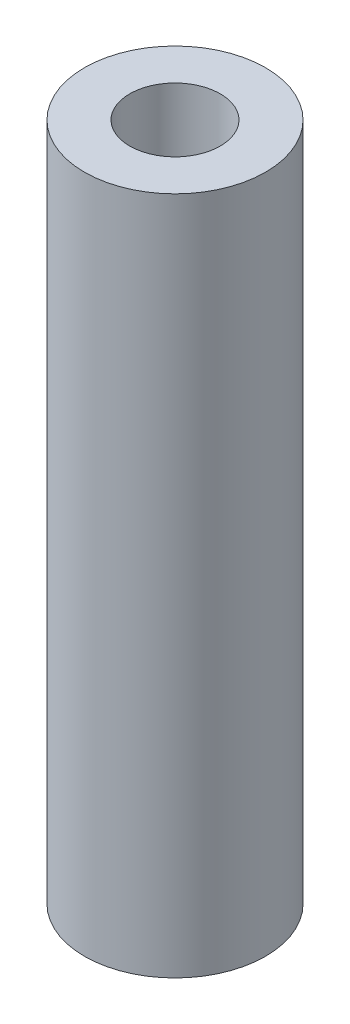
ISO-10303-21;
HEADER;
FILE_DESCRIPTION(('STEP AP214'),'2;1');
FILE_NAME('part.step','',(''),(''),'','','');
FILE_SCHEMA(('AUTOMOTIVE_DESIGN { 1 0 10303 214 1 1 1 1 }'));
ENDSEC;
DATA;
#1=APPLICATION_CONTEXT('core data for automotive mechanical design processes');
#2=APPLICATION_PROTOCOL_DEFINITION('international standard','automotive_design',2000,#1);
#3=PRODUCT_CONTEXT('',#1,'mechanical');
#4=PRODUCT('Part','Part','',(#3));
#5=PRODUCT_RELATED_PRODUCT_CATEGORY('part','',(#4));
#6=PRODUCT_DEFINITION_FORMATION('','',#4);
#7=PRODUCT_DEFINITION_CONTEXT('part definition',#1,'design');
#8=PRODUCT_DEFINITION('design','',#6,#7);
#9=PRODUCT_DEFINITION_SHAPE('','',#8);
#10=(LENGTH_UNIT() NAMED_UNIT(*) SI_UNIT(.MILLI.,.METRE.));
#11=(NAMED_UNIT(*) PLANE_ANGLE_UNIT() SI_UNIT($,.RADIAN.));
#12=(NAMED_UNIT(*) SI_UNIT($,.STERADIAN.) SOLID_ANGLE_UNIT());
#13=UNCERTAINTY_MEASURE_WITH_UNIT(LENGTH_MEASURE(1.E-05),#10,'distance_accuracy_value','');
#14=(GEOMETRIC_REPRESENTATION_CONTEXT(3) GLOBAL_UNCERTAINTY_ASSIGNED_CONTEXT((#13)) GLOBAL_UNIT_ASSIGNED_CONTEXT((#10,
#11,#12)) REPRESENTATION_CONTEXT('',''));
#15=CARTESIAN_POINT('',(0.,0.,0.));
#16=DIRECTION('',(0.,0.,1.));
#17=DIRECTION('',(1.,0.,0.));
#18=AXIS2_PLACEMENT_3D('',#15,#16,#17);
#19=CARTESIAN_POINT('',(0.,30.,0.));
#20=DIRECTION('',(0.,-1.,0.));
#21=DIRECTION('',(0.,0.,-1.));
#22=AXIS2_PLACEMENT_3D('',#19,#20,#21);
#23=CYLINDRICAL_SURFACE('',#22,4.);
#24=CARTESIAN_POINT('',(0.,30.,0.));
#25=DIRECTION('',(0.,1.,0.));
#26=DIRECTION('',(0.,0.,1.));
#27=AXIS2_PLACEMENT_3D('',#24,#25,#26);
#28=CIRCLE('',#27,4.);
#29=CARTESIAN_POINT('',(0.,30.,4.));
#30=VERTEX_POINT('',#29);
#31=EDGE_CURVE('E10',#30,#30,#28,.T.);
#32=ORIENTED_EDGE('',*,*,#31,.F.);
#33=EDGE_LOOP('',(#32));
#34=FACE_BOUND('',#33,.T.);
#35=CARTESIAN_POINT('',(0.,0.,0.));
#36=DIRECTION('',(0.,1.,0.));
#37=DIRECTION('',(0.,0.,1.));
#38=AXIS2_PLACEMENT_3D('',#35,#36,#37);
#39=CIRCLE('',#38,4.);
#40=CARTESIAN_POINT('',(0.,0.,4.));
#41=VERTEX_POINT('',#40);
#42=EDGE_CURVE('E46',#41,#41,#39,.T.);
#43=ORIENTED_EDGE('',*,*,#42,.T.);
#44=EDGE_LOOP('',(#43));
#45=FACE_BOUND('',#44,.T.);
#46=ADVANCED_FACE('F43',(#34,#45),#23,.T.);
#47=CARTESIAN_POINT('',(0.,30.,0.));
#48=DIRECTION('',(0.,1.,0.));
#49=DIRECTION('',(0.,0.,1.));
#50=AXIS2_PLACEMENT_3D('',#47,#48,#49);
#51=PLANE('',#50);
#52=CARTESIAN_POINT('',(0.,30.,0.));
#53=DIRECTION('',(0.,1.,0.));
#54=DIRECTION('',(0.,0.,1.));
#55=AXIS2_PLACEMENT_3D('',#52,#53,#54);
#56=CIRCLE('',#55,2.);
#57=CARTESIAN_POINT('',(0.,30.,2.));
#58=VERTEX_POINT('',#57);
#59=EDGE_CURVE('E57',#58,#58,#56,.T.);
#60=ORIENTED_EDGE('',*,*,#59,.F.);
#61=EDGE_LOOP('',(#60));
#62=FACE_BOUND('',#61,.T.);
#63=ORIENTED_EDGE('',*,*,#31,.T.);
#64=EDGE_LOOP('',(#63));
#65=FACE_BOUND('',#64,.T.);
#66=ADVANCED_FACE('F74',(#62,#65),#51,.T.);
#67=CARTESIAN_POINT('',(0.,0.,0.));
#68=DIRECTION('',(0.,1.,0.));
#69=DIRECTION('',(0.,0.,1.));
#70=AXIS2_PLACEMENT_3D('',#67,#68,#69);
#71=PLANE('',#70);
#72=CARTESIAN_POINT('',(0.,0.,0.));
#73=DIRECTION('',(0.,1.,0.));
#74=DIRECTION('',(0.,0.,1.));
#75=AXIS2_PLACEMENT_3D('',#72,#73,#74);
#76=CIRCLE('',#75,2.);
#77=CARTESIAN_POINT('',(0.,0.,2.));
#78=VERTEX_POINT('',#77);
#79=EDGE_CURVE('E55',#78,#78,#76,.T.);
#80=ORIENTED_EDGE('',*,*,#79,.T.);
#81=EDGE_LOOP('',(#80));
#82=FACE_BOUND('',#81,.T.);
#83=ORIENTED_EDGE('',*,*,#42,.F.);
#84=EDGE_LOOP('',(#83));
#85=FACE_BOUND('',#84,.T.);
#86=ADVANCED_FACE('F65',(#82,#85),#71,.F.);
#87=CARTESIAN_POINT('',(0.,0.,0.));
#88=DIRECTION('',(0.,1.,0.));
#89=DIRECTION('',(0.,0.,1.));
#90=AXIS2_PLACEMENT_3D('',#87,#88,#89);
#91=CYLINDRICAL_SURFACE('',#90,2.);
#92=ORIENTED_EDGE('',*,*,#79,.F.);
#93=EDGE_LOOP('',(#92));
#94=FACE_BOUND('',#93,.T.);
#95=ORIENTED_EDGE('',*,*,#59,.T.);
#96=EDGE_LOOP('',(#95));
#97=FACE_BOUND('',#96,.T.);
#98=ADVANCED_FACE('F68',(#94,#97),#91,.F.);
#99=CLOSED_SHELL('',(#46,#66,#86,#98));
#100=MANIFOLD_SOLID_BREP('B2',#99);
#101=ADVANCED_BREP_SHAPE_REPRESENTATION('',(#18,#100),#14);
#102=SHAPE_DEFINITION_REPRESENTATION(#9,#101);
ENDSEC;
END-ISO-10303-21;
